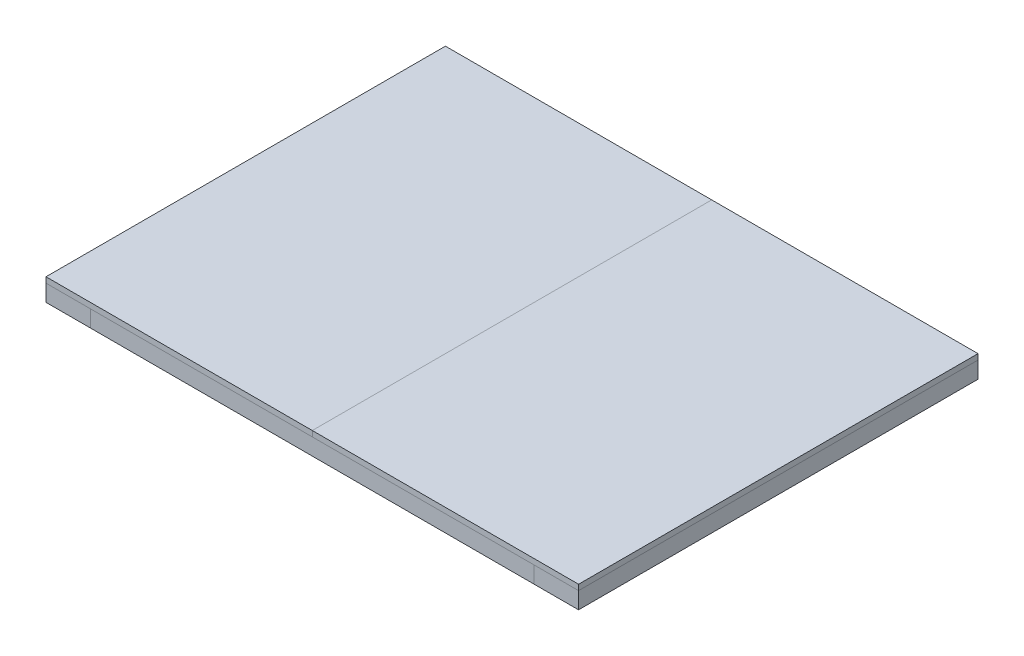
ISO-10303-21;
HEADER;
FILE_DESCRIPTION(('STEP AP214'),'2;1');
FILE_NAME('part.step','',(''),(''),'','','');
FILE_SCHEMA(('AUTOMOTIVE_DESIGN { 1 0 10303 214 1 1 1 1 }'));
ENDSEC;
DATA;
#1=APPLICATION_CONTEXT('core data for automotive mechanical design processes');
#2=APPLICATION_PROTOCOL_DEFINITION('international standard','automotive_design',2000,#1);
#3=PRODUCT_CONTEXT('',#1,'mechanical');
#4=PRODUCT('Part','Part','',(#3));
#5=PRODUCT_RELATED_PRODUCT_CATEGORY('part','',(#4));
#6=PRODUCT_DEFINITION_FORMATION('','',#4);
#7=PRODUCT_DEFINITION_CONTEXT('part definition',#1,'design');
#8=PRODUCT_DEFINITION('design','',#6,#7);
#9=PRODUCT_DEFINITION_SHAPE('','',#8);
#10=(LENGTH_UNIT() NAMED_UNIT(*) SI_UNIT(.MILLI.,.METRE.));
#11=(NAMED_UNIT(*) PLANE_ANGLE_UNIT() SI_UNIT($,.RADIAN.));
#12=(NAMED_UNIT(*) SI_UNIT($,.STERADIAN.) SOLID_ANGLE_UNIT());
#13=UNCERTAINTY_MEASURE_WITH_UNIT(LENGTH_MEASURE(1.E-05),#10,'distance_accuracy_value','');
#14=(GEOMETRIC_REPRESENTATION_CONTEXT(3) GLOBAL_UNCERTAINTY_ASSIGNED_CONTEXT((#13)) GLOBAL_UNIT_ASSIGNED_CONTEXT((#10,
#11,#12)) REPRESENTATION_CONTEXT('',''));
#15=CARTESIAN_POINT('',(0.,0.,0.));
#16=DIRECTION('',(0.,0.,1.));
#17=DIRECTION('',(1.,0.,0.));
#18=AXIS2_PLACEMENT_3D('',#15,#16,#17);
#19=CARTESIAN_POINT('',(660.4,-38.1,-812.8));
#20=DIRECTION('',(-1.,0.,0.));
#21=DIRECTION('',(0.,0.,1.));
#22=AXIS2_PLACEMENT_3D('',#19,#20,#21);
#23=PLANE('',#22);
#24=DIRECTION('',(0.,0.,1.));
#25=VECTOR('',#24,1.);
#26=CARTESIAN_POINT('',(660.4,0.,-812.8));
#27=LINE('',#26,#25);
#28=CARTESIAN_POINT('',(660.4,0.,-812.8));
#29=VERTEX_POINT('',#28);
#30=CARTESIAN_POINT('',(660.4,0.,-101.6));
#31=VERTEX_POINT('',#30);
#32=EDGE_CURVE('E115',#29,#31,#27,.T.);
#33=ORIENTED_EDGE('',*,*,#32,.T.);
#34=DIRECTION('',(0.,1.,0.));
#35=VECTOR('',#34,1.);
#36=CARTESIAN_POINT('',(660.4,-38.1,-101.6));
#37=LINE('',#36,#35);
#38=CARTESIAN_POINT('',(660.4,-38.1,-101.6));
#39=VERTEX_POINT('',#38);
#40=EDGE_CURVE('E12',#39,#31,#37,.T.);
#41=ORIENTED_EDGE('',*,*,#40,.F.);
#42=DIRECTION('',(0.,0.,1.));
#43=VECTOR('',#42,1.);
#44=CARTESIAN_POINT('',(660.4,-38.1,-812.8));
#45=LINE('',#44,#43);
#46=CARTESIAN_POINT('',(660.4,-38.1,-812.8));
#47=VERTEX_POINT('',#46);
#48=EDGE_CURVE('E103',#47,#39,#45,.T.);
#49=ORIENTED_EDGE('',*,*,#48,.F.);
#50=DIRECTION('',(0.,1.,0.));
#51=VECTOR('',#50,1.);
#52=CARTESIAN_POINT('',(660.4,-38.1,-812.8));
#53=LINE('',#52,#51);
#54=EDGE_CURVE('E111',#47,#29,#53,.T.);
#55=ORIENTED_EDGE('',*,*,#54,.T.);
#56=EDGE_LOOP('',(#33,#41,#49,#55));
#57=FACE_BOUND('',#56,.T.);
#58=ADVANCED_FACE('F52',(#57),#23,.F.);
#59=CARTESIAN_POINT('',(660.4,-38.1,-101.6));
#60=DIRECTION('',(0.,0.,-1.));
#61=DIRECTION('',(-1.,0.,0.));
#62=AXIS2_PLACEMENT_3D('',#59,#60,#61);
#63=PLANE('',#62);
#64=DIRECTION('',(-1.,0.,0.));
#65=VECTOR('',#64,1.);
#66=CARTESIAN_POINT('',(660.4,0.,-101.6));
#67=LINE('',#66,#65);
#68=CARTESIAN_POINT('',(558.8,0.,-101.6));
#69=VERTEX_POINT('',#68);
#70=EDGE_CURVE('E107',#31,#69,#67,.T.);
#71=ORIENTED_EDGE('',*,*,#70,.T.);
#72=DIRECTION('',(0.,1.,0.));
#73=VECTOR('',#72,1.);
#74=CARTESIAN_POINT('',(558.8,-38.1,-101.6));
#75=LINE('',#74,#73);
#76=CARTESIAN_POINT('',(558.8,-38.1,-101.6));
#77=VERTEX_POINT('',#76);
#78=EDGE_CURVE('E60',#77,#69,#75,.T.);
#79=ORIENTED_EDGE('',*,*,#78,.F.);
#80=DIRECTION('',(-1.,0.,0.));
#81=VECTOR('',#80,1.);
#82=CARTESIAN_POINT('',(660.4,-38.1,-101.6));
#83=LINE('',#82,#81);
#84=EDGE_CURVE('E98',#39,#77,#83,.T.);
#85=ORIENTED_EDGE('',*,*,#84,.F.);
#86=ORIENTED_EDGE('',*,*,#40,.T.);
#87=EDGE_LOOP('',(#71,#79,#85,#86));
#88=FACE_BOUND('',#87,.T.);
#89=ADVANCED_FACE('F106',(#88),#63,.F.);
#90=CARTESIAN_POINT('',(558.8,-38.1,-812.8));
#91=DIRECTION('',(1.,0.,0.));
#92=DIRECTION('',(0.,0.,-1.));
#93=AXIS2_PLACEMENT_3D('',#90,#91,#92);
#94=PLANE('',#93);
#95=DIRECTION('',(0.,0.,-1.));
#96=VECTOR('',#95,1.);
#97=CARTESIAN_POINT('',(558.8,0.,-812.8));
#98=LINE('',#97,#96);
#99=CARTESIAN_POINT('',(558.8,0.,-812.8));
#100=VERTEX_POINT('',#99);
#101=EDGE_CURVE('E85',#69,#100,#98,.T.);
#102=ORIENTED_EDGE('',*,*,#101,.T.);
#103=DIRECTION('',(0.,1.,0.));
#104=VECTOR('',#103,1.);
#105=CARTESIAN_POINT('',(558.8,-38.1,-812.8));
#106=LINE('',#105,#104);
#107=CARTESIAN_POINT('',(558.8,-38.1,-812.8));
#108=VERTEX_POINT('',#107);
#109=EDGE_CURVE('E108',#108,#100,#106,.T.);
#110=ORIENTED_EDGE('',*,*,#109,.F.);
#111=DIRECTION('',(0.,0.,-1.));
#112=VECTOR('',#111,1.);
#113=CARTESIAN_POINT('',(558.8,-38.1,-812.8));
#114=LINE('',#113,#112);
#115=EDGE_CURVE('E101',#77,#108,#114,.T.);
#116=ORIENTED_EDGE('',*,*,#115,.F.);
#117=ORIENTED_EDGE('',*,*,#78,.T.);
#118=EDGE_LOOP('',(#102,#110,#116,#117));
#119=FACE_BOUND('',#118,.T.);
#120=ADVANCED_FACE('F109',(#119),#94,.F.);
#121=CARTESIAN_POINT('',(660.4,-38.1,-812.8));
#122=DIRECTION('',(0.,0.,1.));
#123=DIRECTION('',(1.,0.,0.));
#124=AXIS2_PLACEMENT_3D('',#121,#122,#123);
#125=PLANE('',#124);
#126=DIRECTION('',(1.,0.,0.));
#127=VECTOR('',#126,1.);
#128=CARTESIAN_POINT('',(660.4,0.,-812.8));
#129=LINE('',#128,#127);
#130=EDGE_CURVE('E91',#100,#29,#129,.T.);
#131=ORIENTED_EDGE('',*,*,#130,.T.);
#132=ORIENTED_EDGE('',*,*,#54,.F.);
#133=DIRECTION('',(1.,0.,0.));
#134=VECTOR('',#133,1.);
#135=CARTESIAN_POINT('',(660.4,-38.1,-812.8));
#136=LINE('',#135,#134);
#137=EDGE_CURVE('E68',#108,#47,#136,.T.);
#138=ORIENTED_EDGE('',*,*,#137,.F.);
#139=ORIENTED_EDGE('',*,*,#109,.T.);
#140=EDGE_LOOP('',(#131,#132,#138,#139));
#141=FACE_BOUND('',#140,.T.);
#142=ADVANCED_FACE('F122',(#141),#125,.F.);
#143=CARTESIAN_POINT('',(0.,-38.1,0.));
#144=DIRECTION('',(0.,-1.,0.));
#145=DIRECTION('',(0.,0.,-1.));
#146=AXIS2_PLACEMENT_3D('',#143,#144,#145);
#147=PLANE('',#146);
#148=ORIENTED_EDGE('',*,*,#48,.T.);
#149=ORIENTED_EDGE('',*,*,#84,.T.);
#150=ORIENTED_EDGE('',*,*,#115,.T.);
#151=ORIENTED_EDGE('',*,*,#137,.T.);
#152=EDGE_LOOP('',(#148,#149,#150,#151));
#153=FACE_BOUND('',#152,.T.);
#154=ADVANCED_FACE('F99',(#153),#147,.T.);
#155=CARTESIAN_POINT('',(0.,0.,0.));
#156=DIRECTION('',(0.,-1.,0.));
#157=DIRECTION('',(0.,0.,-1.));
#158=AXIS2_PLACEMENT_3D('',#155,#156,#157);
#159=PLANE('',#158);
#160=ORIENTED_EDGE('',*,*,#32,.F.);
#161=ORIENTED_EDGE('',*,*,#130,.F.);
#162=ORIENTED_EDGE('',*,*,#101,.F.);
#163=ORIENTED_EDGE('',*,*,#70,.F.);
#164=EDGE_LOOP('',(#160,#161,#162,#163));
#165=FACE_BOUND('',#164,.T.);
#166=ADVANCED_FACE('F125',(#165),#159,.F.);
#167=CLOSED_SHELL('',(#58,#89,#120,#142,#154,#166));
#168=MANIFOLD_SOLID_BREP('B2',#167);
#169=CARTESIAN_POINT('',(1117.6,-38.1,-914.4));
#170=DIRECTION('',(-1.,0.,0.));
#171=DIRECTION('',(0.,0.,1.));
#172=AXIS2_PLACEMENT_3D('',#169,#170,#171);
#173=PLANE('',#172);
#174=DIRECTION('',(0.,0.,1.));
#175=VECTOR('',#174,1.);
#176=CARTESIAN_POINT('',(1117.6,0.,-914.4));
#177=LINE('',#176,#175);
#178=CARTESIAN_POINT('',(1117.6,0.,-914.4));
#179=VERTEX_POINT('',#178);
#180=CARTESIAN_POINT('',(1117.6,0.,-812.8));
#181=VERTEX_POINT('',#180);
#182=EDGE_CURVE('E249',#179,#181,#177,.T.);
#183=ORIENTED_EDGE('',*,*,#182,.T.);
#184=DIRECTION('',(0.,1.,0.));
#185=VECTOR('',#184,1.);
#186=CARTESIAN_POINT('',(1117.6,-38.1,-812.8));
#187=LINE('',#186,#185);
#188=CARTESIAN_POINT('',(1117.6,-38.1,-812.8));
#189=VERTEX_POINT('',#188);
#190=EDGE_CURVE('E50',#189,#181,#187,.T.);
#191=ORIENTED_EDGE('',*,*,#190,.F.);
#192=DIRECTION('',(0.,0.,1.));
#193=VECTOR('',#192,1.);
#194=CARTESIAN_POINT('',(1117.6,-38.1,-914.4));
#195=LINE('',#194,#193);
#196=CARTESIAN_POINT('',(1117.6,-38.1,-914.4));
#197=VERTEX_POINT('',#196);
#198=EDGE_CURVE('E237',#197,#189,#195,.T.);
#199=ORIENTED_EDGE('',*,*,#198,.F.);
#200=DIRECTION('',(0.,1.,0.));
#201=VECTOR('',#200,1.);
#202=CARTESIAN_POINT('',(1117.6,-38.1,-914.4));
#203=LINE('',#202,#201);
#204=EDGE_CURVE('E245',#197,#179,#203,.T.);
#205=ORIENTED_EDGE('',*,*,#204,.T.);
#206=EDGE_LOOP('',(#183,#191,#199,#205));
#207=FACE_BOUND('',#206,.T.);
#208=ADVANCED_FACE('F186',(#207),#173,.F.);
#209=CARTESIAN_POINT('',(1117.6,-38.1,-812.8));
#210=DIRECTION('',(0.,0.,-1.));
#211=DIRECTION('',(-1.,0.,0.));
#212=AXIS2_PLACEMENT_3D('',#209,#210,#211);
#213=PLANE('',#212);
#214=DIRECTION('',(-1.,0.,0.));
#215=VECTOR('',#214,1.);
#216=CARTESIAN_POINT('',(1117.6,0.,-812.8));
#217=LINE('',#216,#215);
#218=CARTESIAN_POINT('',(101.6,0.,-812.8));
#219=VERTEX_POINT('',#218);
#220=EDGE_CURVE('E241',#181,#219,#217,.T.);
#221=ORIENTED_EDGE('',*,*,#220,.T.);
#222=DIRECTION('',(0.,1.,0.));
#223=VECTOR('',#222,1.);
#224=CARTESIAN_POINT('',(101.6,-38.1,-812.8));
#225=LINE('',#224,#223);
#226=CARTESIAN_POINT('',(101.6,-38.1,-812.8));
#227=VERTEX_POINT('',#226);
#228=EDGE_CURVE('E194',#227,#219,#225,.T.);
#229=ORIENTED_EDGE('',*,*,#228,.F.);
#230=DIRECTION('',(-1.,0.,0.));
#231=VECTOR('',#230,1.);
#232=CARTESIAN_POINT('',(1117.6,-38.1,-812.8));
#233=LINE('',#232,#231);
#234=EDGE_CURVE('E232',#189,#227,#233,.T.);
#235=ORIENTED_EDGE('',*,*,#234,.F.);
#236=ORIENTED_EDGE('',*,*,#190,.T.);
#237=EDGE_LOOP('',(#221,#229,#235,#236));
#238=FACE_BOUND('',#237,.T.);
#239=ADVANCED_FACE('F240',(#238),#213,.F.);
#240=CARTESIAN_POINT('',(101.6,-38.1,-914.4));
#241=DIRECTION('',(1.,0.,0.));
#242=DIRECTION('',(0.,0.,-1.));
#243=AXIS2_PLACEMENT_3D('',#240,#241,#242);
#244=PLANE('',#243);
#245=DIRECTION('',(0.,0.,-1.));
#246=VECTOR('',#245,1.);
#247=CARTESIAN_POINT('',(101.6,0.,-914.4));
#248=LINE('',#247,#246);
#249=CARTESIAN_POINT('',(101.6,0.,-914.4));
#250=VERTEX_POINT('',#249);
#251=EDGE_CURVE('E219',#219,#250,#248,.T.);
#252=ORIENTED_EDGE('',*,*,#251,.T.);
#253=DIRECTION('',(0.,1.,0.));
#254=VECTOR('',#253,1.);
#255=CARTESIAN_POINT('',(101.6,-38.1,-914.4));
#256=LINE('',#255,#254);
#257=CARTESIAN_POINT('',(101.6,-38.1,-914.4));
#258=VERTEX_POINT('',#257);
#259=EDGE_CURVE('E242',#258,#250,#256,.T.);
#260=ORIENTED_EDGE('',*,*,#259,.F.);
#261=DIRECTION('',(0.,0.,-1.));
#262=VECTOR('',#261,1.);
#263=CARTESIAN_POINT('',(101.6,-38.1,-914.4));
#264=LINE('',#263,#262);
#265=EDGE_CURVE('E235',#227,#258,#264,.T.);
#266=ORIENTED_EDGE('',*,*,#265,.F.);
#267=ORIENTED_EDGE('',*,*,#228,.T.);
#268=EDGE_LOOP('',(#252,#260,#266,#267));
#269=FACE_BOUND('',#268,.T.);
#270=ADVANCED_FACE('F243',(#269),#244,.F.);
#271=CARTESIAN_POINT('',(1117.6,-38.1,-914.4));
#272=DIRECTION('',(0.,0.,1.));
#273=DIRECTION('',(1.,0.,0.));
#274=AXIS2_PLACEMENT_3D('',#271,#272,#273);
#275=PLANE('',#274);
#276=DIRECTION('',(1.,0.,0.));
#277=VECTOR('',#276,1.);
#278=CARTESIAN_POINT('',(1117.6,0.,-914.4));
#279=LINE('',#278,#277);
#280=EDGE_CURVE('E225',#250,#179,#279,.T.);
#281=ORIENTED_EDGE('',*,*,#280,.T.);
#282=ORIENTED_EDGE('',*,*,#204,.F.);
#283=DIRECTION('',(1.,0.,0.));
#284=VECTOR('',#283,1.);
#285=CARTESIAN_POINT('',(1117.6,-38.1,-914.4));
#286=LINE('',#285,#284);
#287=EDGE_CURVE('E202',#258,#197,#286,.T.);
#288=ORIENTED_EDGE('',*,*,#287,.F.);
#289=ORIENTED_EDGE('',*,*,#259,.T.);
#290=EDGE_LOOP('',(#281,#282,#288,#289));
#291=FACE_BOUND('',#290,.T.);
#292=ADVANCED_FACE('F256',(#291),#275,.F.);
#293=CARTESIAN_POINT('',(0.,-38.1,0.));
#294=DIRECTION('',(0.,-1.,0.));
#295=DIRECTION('',(0.,0.,-1.));
#296=AXIS2_PLACEMENT_3D('',#293,#294,#295);
#297=PLANE('',#296);
#298=ORIENTED_EDGE('',*,*,#198,.T.);
#299=ORIENTED_EDGE('',*,*,#234,.T.);
#300=ORIENTED_EDGE('',*,*,#265,.T.);
#301=ORIENTED_EDGE('',*,*,#287,.T.);
#302=EDGE_LOOP('',(#298,#299,#300,#301));
#303=FACE_BOUND('',#302,.T.);
#304=ADVANCED_FACE('F233',(#303),#297,.T.);
#305=CARTESIAN_POINT('',(0.,0.,0.));
#306=DIRECTION('',(0.,-1.,0.));
#307=DIRECTION('',(0.,0.,-1.));
#308=AXIS2_PLACEMENT_3D('',#305,#306,#307);
#309=PLANE('',#308);
#310=ORIENTED_EDGE('',*,*,#182,.F.);
#311=ORIENTED_EDGE('',*,*,#280,.F.);
#312=ORIENTED_EDGE('',*,*,#251,.F.);
#313=ORIENTED_EDGE('',*,*,#220,.F.);
#314=EDGE_LOOP('',(#310,#311,#312,#313));
#315=FACE_BOUND('',#314,.T.);
#316=ADVANCED_FACE('F259',(#315),#309,.F.);
#317=CLOSED_SHELL('',(#208,#239,#270,#292,#304,#316));
#318=MANIFOLD_SOLID_BREP('B6',#317);
#319=CARTESIAN_POINT('',(1117.6,-38.1,0.));
#320=DIRECTION('',(-1.,0.,0.));
#321=DIRECTION('',(0.,0.,1.));
#322=AXIS2_PLACEMENT_3D('',#319,#320,#321);
#323=PLANE('',#322);
#324=DIRECTION('',(0.,0.,1.));
#325=VECTOR('',#324,1.);
#326=CARTESIAN_POINT('',(1117.6,0.,0.));
#327=LINE('',#326,#325);
#328=CARTESIAN_POINT('',(1117.6,0.,-101.6));
#329=VERTEX_POINT('',#328);
#330=CARTESIAN_POINT('',(1117.6,0.,0.));
#331=VERTEX_POINT('',#330);
#332=EDGE_CURVE('E383',#329,#331,#327,.T.);
#333=ORIENTED_EDGE('',*,*,#332,.T.);
#334=DIRECTION('',(0.,1.,0.));
#335=VECTOR('',#334,1.);
#336=CARTESIAN_POINT('',(1117.6,-38.1,0.));
#337=LINE('',#336,#335);
#338=CARTESIAN_POINT('',(1117.6,-38.1,0.));
#339=VERTEX_POINT('',#338);
#340=EDGE_CURVE('E184',#339,#331,#337,.T.);
#341=ORIENTED_EDGE('',*,*,#340,.F.);
#342=DIRECTION('',(0.,0.,1.));
#343=VECTOR('',#342,1.);
#344=CARTESIAN_POINT('',(1117.6,-38.1,0.));
#345=LINE('',#344,#343);
#346=CARTESIAN_POINT('',(1117.6,-38.1,-101.6));
#347=VERTEX_POINT('',#346);
#348=EDGE_CURVE('E371',#347,#339,#345,.T.);
#349=ORIENTED_EDGE('',*,*,#348,.F.);
#350=DIRECTION('',(0.,1.,0.));
#351=VECTOR('',#350,1.);
#352=CARTESIAN_POINT('',(1117.6,-38.1,-101.6));
#353=LINE('',#352,#351);
#354=EDGE_CURVE('E379',#347,#329,#353,.T.);
#355=ORIENTED_EDGE('',*,*,#354,.T.);
#356=EDGE_LOOP('',(#333,#341,#349,#355));
#357=FACE_BOUND('',#356,.T.);
#358=ADVANCED_FACE('F320',(#357),#323,.F.);
#359=CARTESIAN_POINT('',(1117.6,-38.1,0.));
#360=DIRECTION('',(0.,0.,-1.));
#361=DIRECTION('',(-1.,0.,0.));
#362=AXIS2_PLACEMENT_3D('',#359,#360,#361);
#363=PLANE('',#362);
#364=DIRECTION('',(-1.,0.,0.));
#365=VECTOR('',#364,1.);
#366=CARTESIAN_POINT('',(1117.6,0.,0.));
#367=LINE('',#366,#365);
#368=CARTESIAN_POINT('',(101.6,0.,0.));
#369=VERTEX_POINT('',#368);
#370=EDGE_CURVE('E375',#331,#369,#367,.T.);
#371=ORIENTED_EDGE('',*,*,#370,.T.);
#372=DIRECTION('',(0.,1.,0.));
#373=VECTOR('',#372,1.);
#374=CARTESIAN_POINT('',(101.6,-38.1,0.));
#375=LINE('',#374,#373);
#376=CARTESIAN_POINT('',(101.6,-38.1,0.));
#377=VERTEX_POINT('',#376);
#378=EDGE_CURVE('E328',#377,#369,#375,.T.);
#379=ORIENTED_EDGE('',*,*,#378,.F.);
#380=DIRECTION('',(-1.,0.,0.));
#381=VECTOR('',#380,1.);
#382=CARTESIAN_POINT('',(1117.6,-38.1,0.));
#383=LINE('',#382,#381);
#384=EDGE_CURVE('E366',#339,#377,#383,.T.);
#385=ORIENTED_EDGE('',*,*,#384,.F.);
#386=ORIENTED_EDGE('',*,*,#340,.T.);
#387=EDGE_LOOP('',(#371,#379,#385,#386));
#388=FACE_BOUND('',#387,.T.);
#389=ADVANCED_FACE('F374',(#388),#363,.F.);
#390=CARTESIAN_POINT('',(101.6,-38.1,0.));
#391=DIRECTION('',(1.,0.,0.));
#392=DIRECTION('',(0.,0.,-1.));
#393=AXIS2_PLACEMENT_3D('',#390,#391,#392);
#394=PLANE('',#393);
#395=DIRECTION('',(0.,0.,-1.));
#396=VECTOR('',#395,1.);
#397=CARTESIAN_POINT('',(101.6,0.,0.));
#398=LINE('',#397,#396);
#399=CARTESIAN_POINT('',(101.6,0.,-101.6));
#400=VERTEX_POINT('',#399);
#401=EDGE_CURVE('E353',#369,#400,#398,.T.);
#402=ORIENTED_EDGE('',*,*,#401,.T.);
#403=DIRECTION('',(0.,1.,0.));
#404=VECTOR('',#403,1.);
#405=CARTESIAN_POINT('',(101.6,-38.1,-101.6));
#406=LINE('',#405,#404);
#407=CARTESIAN_POINT('',(101.6,-38.1,-101.6));
#408=VERTEX_POINT('',#407);
#409=EDGE_CURVE('E376',#408,#400,#406,.T.);
#410=ORIENTED_EDGE('',*,*,#409,.F.);
#411=DIRECTION('',(0.,0.,-1.));
#412=VECTOR('',#411,1.);
#413=CARTESIAN_POINT('',(101.6,-38.1,0.));
#414=LINE('',#413,#412);
#415=EDGE_CURVE('E369',#377,#408,#414,.T.);
#416=ORIENTED_EDGE('',*,*,#415,.F.);
#417=ORIENTED_EDGE('',*,*,#378,.T.);
#418=EDGE_LOOP('',(#402,#410,#416,#417));
#419=FACE_BOUND('',#418,.T.);
#420=ADVANCED_FACE('F377',(#419),#394,.F.);
#421=CARTESIAN_POINT('',(1117.6,-38.1,-101.6));
#422=DIRECTION('',(0.,0.,1.));
#423=DIRECTION('',(1.,0.,0.));
#424=AXIS2_PLACEMENT_3D('',#421,#422,#423);
#425=PLANE('',#424);
#426=DIRECTION('',(1.,0.,0.));
#427=VECTOR('',#426,1.);
#428=CARTESIAN_POINT('',(1117.6,0.,-101.6));
#429=LINE('',#428,#427);
#430=EDGE_CURVE('E359',#400,#329,#429,.T.);
#431=ORIENTED_EDGE('',*,*,#430,.T.);
#432=ORIENTED_EDGE('',*,*,#354,.F.);
#433=DIRECTION('',(1.,0.,0.));
#434=VECTOR('',#433,1.);
#435=CARTESIAN_POINT('',(1117.6,-38.1,-101.6));
#436=LINE('',#435,#434);
#437=EDGE_CURVE('E336',#408,#347,#436,.T.);
#438=ORIENTED_EDGE('',*,*,#437,.F.);
#439=ORIENTED_EDGE('',*,*,#409,.T.);
#440=EDGE_LOOP('',(#431,#432,#438,#439));
#441=FACE_BOUND('',#440,.T.);
#442=ADVANCED_FACE('F390',(#441),#425,.F.);
#443=CARTESIAN_POINT('',(0.,-38.1,0.));
#444=DIRECTION('',(0.,1.,0.));
#445=DIRECTION('',(0.,0.,1.));
#446=AXIS2_PLACEMENT_3D('',#443,#444,#445);
#447=PLANE('',#446);
#448=ORIENTED_EDGE('',*,*,#348,.T.);
#449=ORIENTED_EDGE('',*,*,#384,.T.);
#450=ORIENTED_EDGE('',*,*,#415,.T.);
#451=ORIENTED_EDGE('',*,*,#437,.T.);
#452=EDGE_LOOP('',(#448,#449,#450,#451));
#453=FACE_BOUND('',#452,.T.);
#454=ADVANCED_FACE('F367',(#453),#447,.F.);
#455=CARTESIAN_POINT('',(0.,0.,0.));
#456=DIRECTION('',(0.,1.,0.));
#457=DIRECTION('',(0.,0.,1.));
#458=AXIS2_PLACEMENT_3D('',#455,#456,#457);
#459=PLANE('',#458);
#460=ORIENTED_EDGE('',*,*,#332,.F.);
#461=ORIENTED_EDGE('',*,*,#430,.F.);
#462=ORIENTED_EDGE('',*,*,#401,.F.);
#463=ORIENTED_EDGE('',*,*,#370,.F.);
#464=EDGE_LOOP('',(#460,#461,#462,#463));
#465=FACE_BOUND('',#464,.T.);
#466=ADVANCED_FACE('F393',(#465),#459,.T.);
#467=CLOSED_SHELL('',(#358,#389,#420,#442,#454,#466));
#468=MANIFOLD_SOLID_BREP('B44',#467);
#469=CARTESIAN_POINT('',(0.,-38.1,-914.4));
#470=DIRECTION('',(1.,0.,0.));
#471=DIRECTION('',(0.,0.,-1.));
#472=AXIS2_PLACEMENT_3D('',#469,#470,#471);
#473=PLANE('',#472);
#474=DIRECTION('',(0.,0.,-1.));
#475=VECTOR('',#474,1.);
#476=CARTESIAN_POINT('',(0.,0.,-914.4));
#477=LINE('',#476,#475);
#478=CARTESIAN_POINT('',(0.,0.,0.));
#479=VERTEX_POINT('',#478);
#480=CARTESIAN_POINT('',(0.,0.,-914.4));
#481=VERTEX_POINT('',#480);
#482=EDGE_CURVE('E517',#479,#481,#477,.T.);
#483=ORIENTED_EDGE('',*,*,#482,.T.);
#484=DIRECTION('',(0.,1.,0.));
#485=VECTOR('',#484,1.);
#486=CARTESIAN_POINT('',(0.,-38.1,-914.4));
#487=LINE('',#486,#485);
#488=CARTESIAN_POINT('',(0.,-38.1,-914.4));
#489=VERTEX_POINT('',#488);
#490=EDGE_CURVE('E318',#489,#481,#487,.T.);
#491=ORIENTED_EDGE('',*,*,#490,.F.);
#492=DIRECTION('',(0.,0.,-1.));
#493=VECTOR('',#492,1.);
#494=CARTESIAN_POINT('',(0.,-38.1,-914.4));
#495=LINE('',#494,#493);
#496=CARTESIAN_POINT('',(0.,-38.1,0.));
#497=VERTEX_POINT('',#496);
#498=EDGE_CURVE('E505',#497,#489,#495,.T.);
#499=ORIENTED_EDGE('',*,*,#498,.F.);
#500=DIRECTION('',(0.,1.,0.));
#501=VECTOR('',#500,1.);
#502=CARTESIAN_POINT('',(0.,-38.1,0.));
#503=LINE('',#502,#501);
#504=EDGE_CURVE('E513',#497,#479,#503,.T.);
#505=ORIENTED_EDGE('',*,*,#504,.T.);
#506=EDGE_LOOP('',(#483,#491,#499,#505));
#507=FACE_BOUND('',#506,.T.);
#508=ADVANCED_FACE('F454',(#507),#473,.F.);
#509=CARTESIAN_POINT('',(0.,-38.1,-914.4));
#510=DIRECTION('',(0.,0.,1.));
#511=DIRECTION('',(1.,0.,0.));
#512=AXIS2_PLACEMENT_3D('',#509,#510,#511);
#513=PLANE('',#512);
#514=DIRECTION('',(1.,0.,0.));
#515=VECTOR('',#514,1.);
#516=CARTESIAN_POINT('',(0.,0.,-914.4));
#517=LINE('',#516,#515);
#518=CARTESIAN_POINT('',(101.6,0.,-914.4));
#519=VERTEX_POINT('',#518);
#520=EDGE_CURVE('E509',#481,#519,#517,.T.);
#521=ORIENTED_EDGE('',*,*,#520,.T.);
#522=DIRECTION('',(0.,1.,0.));
#523=VECTOR('',#522,1.);
#524=CARTESIAN_POINT('',(101.6,-38.1,-914.4));
#525=LINE('',#524,#523);
#526=CARTESIAN_POINT('',(101.6,-38.1,-914.4));
#527=VERTEX_POINT('',#526);
#528=EDGE_CURVE('E462',#527,#519,#525,.T.);
#529=ORIENTED_EDGE('',*,*,#528,.F.);
#530=DIRECTION('',(1.,0.,0.));
#531=VECTOR('',#530,1.);
#532=CARTESIAN_POINT('',(0.,-38.1,-914.4));
#533=LINE('',#532,#531);
#534=EDGE_CURVE('E500',#489,#527,#533,.T.);
#535=ORIENTED_EDGE('',*,*,#534,.F.);
#536=ORIENTED_EDGE('',*,*,#490,.T.);
#537=EDGE_LOOP('',(#521,#529,#535,#536));
#538=FACE_BOUND('',#537,.T.);
#539=ADVANCED_FACE('F508',(#538),#513,.F.);
#540=CARTESIAN_POINT('',(101.6,-38.1,-914.4));
#541=DIRECTION('',(-1.,0.,0.));
#542=DIRECTION('',(0.,0.,1.));
#543=AXIS2_PLACEMENT_3D('',#540,#541,#542);
#544=PLANE('',#543);
#545=DIRECTION('',(0.,0.,1.));
#546=VECTOR('',#545,1.);
#547=CARTESIAN_POINT('',(101.6,0.,-914.4));
#548=LINE('',#547,#546);
#549=CARTESIAN_POINT('',(101.6,0.,0.));
#550=VERTEX_POINT('',#549);
#551=EDGE_CURVE('E487',#519,#550,#548,.T.);
#552=ORIENTED_EDGE('',*,*,#551,.T.);
#553=DIRECTION('',(0.,1.,0.));
#554=VECTOR('',#553,1.);
#555=CARTESIAN_POINT('',(101.6,-38.1,0.));
#556=LINE('',#555,#554);
#557=CARTESIAN_POINT('',(101.6,-38.1,0.));
#558=VERTEX_POINT('',#557);
#559=EDGE_CURVE('E510',#558,#550,#556,.T.);
#560=ORIENTED_EDGE('',*,*,#559,.F.);
#561=DIRECTION('',(0.,0.,1.));
#562=VECTOR('',#561,1.);
#563=CARTESIAN_POINT('',(101.6,-38.1,-914.4));
#564=LINE('',#563,#562);
#565=EDGE_CURVE('E503',#527,#558,#564,.T.);
#566=ORIENTED_EDGE('',*,*,#565,.F.);
#567=ORIENTED_EDGE('',*,*,#528,.T.);
#568=EDGE_LOOP('',(#552,#560,#566,#567));
#569=FACE_BOUND('',#568,.T.);
#570=ADVANCED_FACE('F511',(#569),#544,.F.);
#571=CARTESIAN_POINT('',(0.,-38.1,0.));
#572=DIRECTION('',(0.,0.,-1.));
#573=DIRECTION('',(-1.,0.,0.));
#574=AXIS2_PLACEMENT_3D('',#571,#572,#573);
#575=PLANE('',#574);
#576=DIRECTION('',(-1.,0.,0.));
#577=VECTOR('',#576,1.);
#578=CARTESIAN_POINT('',(0.,0.,0.));
#579=LINE('',#578,#577);
#580=EDGE_CURVE('E493',#550,#479,#579,.T.);
#581=ORIENTED_EDGE('',*,*,#580,.T.);
#582=ORIENTED_EDGE('',*,*,#504,.F.);
#583=DIRECTION('',(-1.,0.,0.));
#584=VECTOR('',#583,1.);
#585=CARTESIAN_POINT('',(0.,-38.1,0.));
#586=LINE('',#585,#584);
#587=EDGE_CURVE('E470',#558,#497,#586,.T.);
#588=ORIENTED_EDGE('',*,*,#587,.F.);
#589=ORIENTED_EDGE('',*,*,#559,.T.);
#590=EDGE_LOOP('',(#581,#582,#588,#589));
#591=FACE_BOUND('',#590,.T.);
#592=ADVANCED_FACE('F524',(#591),#575,.F.);
#593=CARTESIAN_POINT('',(0.,-38.1,0.));
#594=DIRECTION('',(0.,1.,0.));
#595=DIRECTION('',(0.,0.,1.));
#596=AXIS2_PLACEMENT_3D('',#593,#594,#595);
#597=PLANE('',#596);
#598=ORIENTED_EDGE('',*,*,#498,.T.);
#599=ORIENTED_EDGE('',*,*,#534,.T.);
#600=ORIENTED_EDGE('',*,*,#565,.T.);
#601=ORIENTED_EDGE('',*,*,#587,.T.);
#602=EDGE_LOOP('',(#598,#599,#600,#601));
#603=FACE_BOUND('',#602,.T.);
#604=ADVANCED_FACE('F501',(#603),#597,.F.);
#605=CARTESIAN_POINT('',(0.,0.,0.));
#606=DIRECTION('',(0.,1.,0.));
#607=DIRECTION('',(0.,0.,1.));
#608=AXIS2_PLACEMENT_3D('',#605,#606,#607);
#609=PLANE('',#608);
#610=ORIENTED_EDGE('',*,*,#482,.F.);
#611=ORIENTED_EDGE('',*,*,#580,.F.);
#612=ORIENTED_EDGE('',*,*,#551,.F.);
#613=ORIENTED_EDGE('',*,*,#520,.F.);
#614=EDGE_LOOP('',(#610,#611,#612,#613));
#615=FACE_BOUND('',#614,.T.);
#616=ADVANCED_FACE('F527',(#615),#609,.T.);
#617=CLOSED_SHELL('',(#508,#539,#570,#592,#604,#616));
#618=MANIFOLD_SOLID_BREP('B178',#617);
#619=CARTESIAN_POINT('',(1219.2,-38.1,-914.4));
#620=DIRECTION('',(-1.,0.,0.));
#621=DIRECTION('',(0.,0.,1.));
#622=AXIS2_PLACEMENT_3D('',#619,#620,#621);
#623=PLANE('',#622);
#624=DIRECTION('',(0.,0.,1.));
#625=VECTOR('',#624,1.);
#626=CARTESIAN_POINT('',(1219.2,0.,-914.4));
#627=LINE('',#626,#625);
#628=CARTESIAN_POINT('',(1219.2,0.,-914.4));
#629=VERTEX_POINT('',#628);
#630=CARTESIAN_POINT('',(1219.2,0.,0.));
#631=VERTEX_POINT('',#630);
#632=EDGE_CURVE('E651',#629,#631,#627,.T.);
#633=ORIENTED_EDGE('',*,*,#632,.T.);
#634=DIRECTION('',(0.,1.,0.));
#635=VECTOR('',#634,1.);
#636=CARTESIAN_POINT('',(1219.2,-38.1,0.));
#637=LINE('',#636,#635);
#638=CARTESIAN_POINT('',(1219.2,-38.1,0.));
#639=VERTEX_POINT('',#638);
#640=EDGE_CURVE('E452',#639,#631,#637,.T.);
#641=ORIENTED_EDGE('',*,*,#640,.F.);
#642=DIRECTION('',(0.,0.,1.));
#643=VECTOR('',#642,1.);
#644=CARTESIAN_POINT('',(1219.2,-38.1,-914.4));
#645=LINE('',#644,#643);
#646=CARTESIAN_POINT('',(1219.2,-38.1,-914.4));
#647=VERTEX_POINT('',#646);
#648=EDGE_CURVE('E639',#647,#639,#645,.T.);
#649=ORIENTED_EDGE('',*,*,#648,.F.);
#650=DIRECTION('',(0.,1.,0.));
#651=VECTOR('',#650,1.);
#652=CARTESIAN_POINT('',(1219.2,-38.1,-914.4));
#653=LINE('',#652,#651);
#654=EDGE_CURVE('E647',#647,#629,#653,.T.);
#655=ORIENTED_EDGE('',*,*,#654,.T.);
#656=EDGE_LOOP('',(#633,#641,#649,#655));
#657=FACE_BOUND('',#656,.T.);
#658=ADVANCED_FACE('F588',(#657),#623,.F.);
#659=CARTESIAN_POINT('',(1219.2,-38.1,0.));
#660=DIRECTION('',(0.,0.,-1.));
#661=DIRECTION('',(-1.,0.,0.));
#662=AXIS2_PLACEMENT_3D('',#659,#660,#661);
#663=PLANE('',#662);
#664=DIRECTION('',(-1.,0.,0.));
#665=VECTOR('',#664,1.);
#666=CARTESIAN_POINT('',(1219.2,0.,0.));
#667=LINE('',#666,#665);
#668=CARTESIAN_POINT('',(1117.6,0.,0.));
#669=VERTEX_POINT('',#668);
#670=EDGE_CURVE('E643',#631,#669,#667,.T.);
#671=ORIENTED_EDGE('',*,*,#670,.T.);
#672=DIRECTION('',(0.,1.,0.));
#673=VECTOR('',#672,1.);
#674=CARTESIAN_POINT('',(1117.6,-38.1,0.));
#675=LINE('',#674,#673);
#676=CARTESIAN_POINT('',(1117.6,-38.1,0.));
#677=VERTEX_POINT('',#676);
#678=EDGE_CURVE('E596',#677,#669,#675,.T.);
#679=ORIENTED_EDGE('',*,*,#678,.F.);
#680=DIRECTION('',(-1.,0.,0.));
#681=VECTOR('',#680,1.);
#682=CARTESIAN_POINT('',(1219.2,-38.1,0.));
#683=LINE('',#682,#681);
#684=EDGE_CURVE('E634',#639,#677,#683,.T.);
#685=ORIENTED_EDGE('',*,*,#684,.F.);
#686=ORIENTED_EDGE('',*,*,#640,.T.);
#687=EDGE_LOOP('',(#671,#679,#685,#686));
#688=FACE_BOUND('',#687,.T.);
#689=ADVANCED_FACE('F642',(#688),#663,.F.);
#690=CARTESIAN_POINT('',(1117.6,-38.1,-914.4));
#691=DIRECTION('',(1.,0.,0.));
#692=DIRECTION('',(0.,0.,-1.));
#693=AXIS2_PLACEMENT_3D('',#690,#691,#692);
#694=PLANE('',#693);
#695=DIRECTION('',(0.,0.,-1.));
#696=VECTOR('',#695,1.);
#697=CARTESIAN_POINT('',(1117.6,0.,-914.4));
#698=LINE('',#697,#696);
#699=CARTESIAN_POINT('',(1117.6,0.,-914.4));
#700=VERTEX_POINT('',#699);
#701=EDGE_CURVE('E621',#669,#700,#698,.T.);
#702=ORIENTED_EDGE('',*,*,#701,.T.);
#703=DIRECTION('',(0.,1.,0.));
#704=VECTOR('',#703,1.);
#705=CARTESIAN_POINT('',(1117.6,-38.1,-914.4));
#706=LINE('',#705,#704);
#707=CARTESIAN_POINT('',(1117.6,-38.1,-914.4));
#708=VERTEX_POINT('',#707);
#709=EDGE_CURVE('E644',#708,#700,#706,.T.);
#710=ORIENTED_EDGE('',*,*,#709,.F.);
#711=DIRECTION('',(0.,0.,-1.));
#712=VECTOR('',#711,1.);
#713=CARTESIAN_POINT('',(1117.6,-38.1,-914.4));
#714=LINE('',#713,#712);
#715=EDGE_CURVE('E637',#677,#708,#714,.T.);
#716=ORIENTED_EDGE('',*,*,#715,.F.);
#717=ORIENTED_EDGE('',*,*,#678,.T.);
#718=EDGE_LOOP('',(#702,#710,#716,#717));
#719=FACE_BOUND('',#718,.T.);
#720=ADVANCED_FACE('F645',(#719),#694,.F.);
#721=CARTESIAN_POINT('',(1219.2,-38.1,-914.4));
#722=DIRECTION('',(0.,0.,1.));
#723=DIRECTION('',(1.,0.,0.));
#724=AXIS2_PLACEMENT_3D('',#721,#722,#723);
#725=PLANE('',#724);
#726=DIRECTION('',(1.,0.,0.));
#727=VECTOR('',#726,1.);
#728=CARTESIAN_POINT('',(1219.2,0.,-914.4));
#729=LINE('',#728,#727);
#730=EDGE_CURVE('E627',#700,#629,#729,.T.);
#731=ORIENTED_EDGE('',*,*,#730,.T.);
#732=ORIENTED_EDGE('',*,*,#654,.F.);
#733=DIRECTION('',(1.,0.,0.));
#734=VECTOR('',#733,1.);
#735=CARTESIAN_POINT('',(1219.2,-38.1,-914.4));
#736=LINE('',#735,#734);
#737=EDGE_CURVE('E604',#708,#647,#736,.T.);
#738=ORIENTED_EDGE('',*,*,#737,.F.);
#739=ORIENTED_EDGE('',*,*,#709,.T.);
#740=EDGE_LOOP('',(#731,#732,#738,#739));
#741=FACE_BOUND('',#740,.T.);
#742=ADVANCED_FACE('F658',(#741),#725,.F.);
#743=CARTESIAN_POINT('',(0.,-38.1,0.));
#744=DIRECTION('',(0.,-1.,0.));
#745=DIRECTION('',(0.,0.,-1.));
#746=AXIS2_PLACEMENT_3D('',#743,#744,#745);
#747=PLANE('',#746);
#748=ORIENTED_EDGE('',*,*,#648,.T.);
#749=ORIENTED_EDGE('',*,*,#684,.T.);
#750=ORIENTED_EDGE('',*,*,#715,.T.);
#751=ORIENTED_EDGE('',*,*,#737,.T.);
#752=EDGE_LOOP('',(#748,#749,#750,#751));
#753=FACE_BOUND('',#752,.T.);
#754=ADVANCED_FACE('F635',(#753),#747,.T.);
#755=CARTESIAN_POINT('',(0.,0.,0.));
#756=DIRECTION('',(0.,-1.,0.));
#757=DIRECTION('',(0.,0.,-1.));
#758=AXIS2_PLACEMENT_3D('',#755,#756,#757);
#759=PLANE('',#758);
#760=ORIENTED_EDGE('',*,*,#632,.F.);
#761=ORIENTED_EDGE('',*,*,#730,.F.);
#762=ORIENTED_EDGE('',*,*,#701,.F.);
#763=ORIENTED_EDGE('',*,*,#670,.F.);
#764=EDGE_LOOP('',(#760,#761,#762,#763));
#765=FACE_BOUND('',#764,.T.);
#766=ADVANCED_FACE('F661',(#765),#759,.F.);
#767=CLOSED_SHELL('',(#658,#689,#720,#742,#754,#766));
#768=MANIFOLD_SOLID_BREP('B312',#767);
#769=CARTESIAN_POINT('',(609.6,12.7,0.));
#770=DIRECTION('',(1.,0.,0.));
#771=DIRECTION('',(0.,0.,-1.));
#772=AXIS2_PLACEMENT_3D('',#769,#770,#771);
#773=PLANE('',#772);
#774=DIRECTION('',(0.,0.,1.));
#775=VECTOR('',#774,1.);
#776=CARTESIAN_POINT('',(609.6,0.,0.));
#777=LINE('',#776,#775);
#778=CARTESIAN_POINT('',(609.6,0.,-914.4));
#779=VERTEX_POINT('',#778);
#780=CARTESIAN_POINT('',(609.6,0.,0.));
#781=VERTEX_POINT('',#780);
#782=EDGE_CURVE('E784',#779,#781,#777,.T.);
#783=ORIENTED_EDGE('',*,*,#782,.T.);
#784=DIRECTION('',(0.,-1.,0.));
#785=VECTOR('',#784,1.);
#786=CARTESIAN_POINT('',(609.6,12.7,0.));
#787=LINE('',#786,#785);
#788=CARTESIAN_POINT('',(609.6,12.7,0.));
#789=VERTEX_POINT('',#788);
#790=EDGE_CURVE('E586',#789,#781,#787,.T.);
#791=ORIENTED_EDGE('',*,*,#790,.F.);
#792=DIRECTION('',(0.,0.,1.));
#793=VECTOR('',#792,1.);
#794=CARTESIAN_POINT('',(609.6,12.7,0.));
#795=LINE('',#794,#793);
#796=CARTESIAN_POINT('',(609.6,12.7,-914.4));
#797=VERTEX_POINT('',#796);
#798=EDGE_CURVE('E772',#797,#789,#795,.T.);
#799=ORIENTED_EDGE('',*,*,#798,.F.);
#800=DIRECTION('',(0.,-1.,0.));
#801=VECTOR('',#800,1.);
#802=CARTESIAN_POINT('',(609.6,12.7,-914.4));
#803=LINE('',#802,#801);
#804=EDGE_CURVE('E780',#797,#779,#803,.T.);
#805=ORIENTED_EDGE('',*,*,#804,.T.);
#806=EDGE_LOOP('',(#783,#791,#799,#805));
#807=FACE_BOUND('',#806,.T.);
#808=ADVANCED_FACE('F721',(#807),#773,.F.);
#809=CARTESIAN_POINT('',(609.6,12.7,0.));
#810=DIRECTION('',(0.,0.,-1.));
#811=DIRECTION('',(-1.,0.,0.));
#812=AXIS2_PLACEMENT_3D('',#809,#810,#811);
#813=PLANE('',#812);
#814=DIRECTION('',(1.,0.,0.));
#815=VECTOR('',#814,1.);
#816=CARTESIAN_POINT('',(609.6,0.,0.));
#817=LINE('',#816,#815);
#818=CARTESIAN_POINT('',(1219.2,0.,0.));
#819=VERTEX_POINT('',#818);
#820=EDGE_CURVE('E776',#781,#819,#817,.T.);
#821=ORIENTED_EDGE('',*,*,#820,.T.);
#822=DIRECTION('',(0.,-1.,0.));
#823=VECTOR('',#822,1.);
#824=CARTESIAN_POINT('',(1219.2,12.7,0.));
#825=LINE('',#824,#823);
#826=CARTESIAN_POINT('',(1219.2,12.7,0.));
#827=VERTEX_POINT('',#826);
#828=EDGE_CURVE('E729',#827,#819,#825,.T.);
#829=ORIENTED_EDGE('',*,*,#828,.F.);
#830=DIRECTION('',(1.,0.,0.));
#831=VECTOR('',#830,1.);
#832=CARTESIAN_POINT('',(609.6,12.7,0.));
#833=LINE('',#832,#831);
#834=EDGE_CURVE('E767',#789,#827,#833,.T.);
#835=ORIENTED_EDGE('',*,*,#834,.F.);
#836=ORIENTED_EDGE('',*,*,#790,.T.);
#837=EDGE_LOOP('',(#821,#829,#835,#836));
#838=FACE_BOUND('',#837,.T.);
#839=ADVANCED_FACE('F775',(#838),#813,.F.);
#840=CARTESIAN_POINT('',(1219.2,12.7,0.));
#841=DIRECTION('',(-1.,0.,0.));
#842=DIRECTION('',(0.,0.,1.));
#843=AXIS2_PLACEMENT_3D('',#840,#841,#842);
#844=PLANE('',#843);
#845=DIRECTION('',(0.,0.,-1.));
#846=VECTOR('',#845,1.);
#847=CARTESIAN_POINT('',(1219.2,0.,0.));
#848=LINE('',#847,#846);
#849=CARTESIAN_POINT('',(1219.2,0.,-914.4));
#850=VERTEX_POINT('',#849);
#851=EDGE_CURVE('E754',#819,#850,#848,.T.);
#852=ORIENTED_EDGE('',*,*,#851,.T.);
#853=DIRECTION('',(0.,-1.,0.));
#854=VECTOR('',#853,1.);
#855=CARTESIAN_POINT('',(1219.2,12.7,-914.4));
#856=LINE('',#855,#854);
#857=CARTESIAN_POINT('',(1219.2,12.7,-914.4));
#858=VERTEX_POINT('',#857);
#859=EDGE_CURVE('E777',#858,#850,#856,.T.);
#860=ORIENTED_EDGE('',*,*,#859,.F.);
#861=DIRECTION('',(0.,0.,-1.));
#862=VECTOR('',#861,1.);
#863=CARTESIAN_POINT('',(1219.2,12.7,0.));
#864=LINE('',#863,#862);
#865=EDGE_CURVE('E770',#827,#858,#864,.T.);
#866=ORIENTED_EDGE('',*,*,#865,.F.);
#867=ORIENTED_EDGE('',*,*,#828,.T.);
#868=EDGE_LOOP('',(#852,#860,#866,#867));
#869=FACE_BOUND('',#868,.T.);
#870=ADVANCED_FACE('F778',(#869),#844,.F.);
#871=CARTESIAN_POINT('',(609.6,12.7,-914.4));
#872=DIRECTION('',(0.,0.,1.));
#873=DIRECTION('',(1.,0.,0.));
#874=AXIS2_PLACEMENT_3D('',#871,#872,#873);
#875=PLANE('',#874);
#876=DIRECTION('',(-1.,0.,0.));
#877=VECTOR('',#876,1.);
#878=CARTESIAN_POINT('',(609.6,0.,-914.4));
#879=LINE('',#878,#877);
#880=EDGE_CURVE('E760',#850,#779,#879,.T.);
#881=ORIENTED_EDGE('',*,*,#880,.T.);
#882=ORIENTED_EDGE('',*,*,#804,.F.);
#883=DIRECTION('',(-1.,0.,0.));
#884=VECTOR('',#883,1.);
#885=CARTESIAN_POINT('',(609.6,12.7,-914.4));
#886=LINE('',#885,#884);
#887=EDGE_CURVE('E737',#858,#797,#886,.T.);
#888=ORIENTED_EDGE('',*,*,#887,.F.);
#889=ORIENTED_EDGE('',*,*,#859,.T.);
#890=EDGE_LOOP('',(#881,#882,#888,#889));
#891=FACE_BOUND('',#890,.T.);
#892=ADVANCED_FACE('F791',(#891),#875,.F.);
#893=CARTESIAN_POINT('',(0.,12.7,0.));
#894=DIRECTION('',(0.,-1.,0.));
#895=DIRECTION('',(0.,0.,-1.));
#896=AXIS2_PLACEMENT_3D('',#893,#894,#895);
#897=PLANE('',#896);
#898=ORIENTED_EDGE('',*,*,#798,.T.);
#899=ORIENTED_EDGE('',*,*,#834,.T.);
#900=ORIENTED_EDGE('',*,*,#865,.T.);
#901=ORIENTED_EDGE('',*,*,#887,.T.);
#902=EDGE_LOOP('',(#898,#899,#900,#901));
#903=FACE_BOUND('',#902,.T.);
#904=ADVANCED_FACE('F768',(#903),#897,.F.);
#905=CARTESIAN_POINT('',(0.,0.,0.));
#906=DIRECTION('',(0.,-1.,0.));
#907=DIRECTION('',(0.,0.,-1.));
#908=AXIS2_PLACEMENT_3D('',#905,#906,#907);
#909=PLANE('',#908);
#910=ORIENTED_EDGE('',*,*,#782,.F.);
#911=ORIENTED_EDGE('',*,*,#880,.F.);
#912=ORIENTED_EDGE('',*,*,#851,.F.);
#913=ORIENTED_EDGE('',*,*,#820,.F.);
#914=EDGE_LOOP('',(#910,#911,#912,#913));
#915=FACE_BOUND('',#914,.T.);
#916=ADVANCED_FACE('F794',(#915),#909,.T.);
#917=CLOSED_SHELL('',(#808,#839,#870,#892,#904,#916));
#918=MANIFOLD_SOLID_BREP('B446',#917);
#919=CARTESIAN_POINT('',(0.,12.7,0.));
#920=DIRECTION('',(1.,0.,0.));
#921=DIRECTION('',(0.,0.,-1.));
#922=AXIS2_PLACEMENT_3D('',#919,#920,#921);
#923=PLANE('',#922);
#924=DIRECTION('',(0.,0.,1.));
#925=VECTOR('',#924,1.);
#926=CARTESIAN_POINT('',(0.,0.,0.));
#927=LINE('',#926,#925);
#928=CARTESIAN_POINT('',(0.,0.,-914.4));
#929=VERTEX_POINT('',#928);
#930=CARTESIAN_POINT('',(0.,0.,0.));
#931=VERTEX_POINT('',#930);
#932=EDGE_CURVE('E908',#929,#931,#927,.T.);
#933=ORIENTED_EDGE('',*,*,#932,.T.);
#934=DIRECTION('',(0.,-1.,0.));
#935=VECTOR('',#934,1.);
#936=CARTESIAN_POINT('',(0.,12.7,0.));
#937=LINE('',#936,#935);
#938=CARTESIAN_POINT('',(0.,12.7,0.));
#939=VERTEX_POINT('',#938);
#940=EDGE_CURVE('E719',#939,#931,#937,.T.);
#941=ORIENTED_EDGE('',*,*,#940,.F.);
#942=DIRECTION('',(0.,0.,1.));
#943=VECTOR('',#942,1.);
#944=CARTESIAN_POINT('',(0.,12.7,0.));
#945=LINE('',#944,#943);
#946=CARTESIAN_POINT('',(0.,12.7,-914.4));
#947=VERTEX_POINT('',#946);
#948=EDGE_CURVE('E896',#947,#939,#945,.T.);
#949=ORIENTED_EDGE('',*,*,#948,.F.);
#950=DIRECTION('',(0.,-1.,0.));
#951=VECTOR('',#950,1.);
#952=CARTESIAN_POINT('',(0.,12.7,-914.4));
#953=LINE('',#952,#951);
#954=EDGE_CURVE('E904',#947,#929,#953,.T.);
#955=ORIENTED_EDGE('',*,*,#954,.T.);
#956=EDGE_LOOP('',(#933,#941,#949,#955));
#957=FACE_BOUND('',#956,.T.);
#958=ADVANCED_FACE('F845',(#957),#923,.F.);
#959=CARTESIAN_POINT('',(0.,12.7,0.));
#960=DIRECTION('',(0.,0.,-1.));
#961=DIRECTION('',(-1.,0.,0.));
#962=AXIS2_PLACEMENT_3D('',#959,#960,#961);
#963=PLANE('',#962);
#964=DIRECTION('',(1.,0.,0.));
#965=VECTOR('',#964,1.);
#966=CARTESIAN_POINT('',(0.,0.,0.));
#967=LINE('',#966,#965);
#968=CARTESIAN_POINT('',(609.6,0.,0.));
#969=VERTEX_POINT('',#968);
#970=EDGE_CURVE('E900',#931,#969,#967,.T.);
#971=ORIENTED_EDGE('',*,*,#970,.T.);
#972=DIRECTION('',(0.,-1.,0.));
#973=VECTOR('',#972,1.);
#974=CARTESIAN_POINT('',(609.6,12.7,0.));
#975=LINE('',#974,#973);
#976=CARTESIAN_POINT('',(609.6,12.7,0.));
#977=VERTEX_POINT('',#976);
#978=EDGE_CURVE('E853',#977,#969,#975,.T.);
#979=ORIENTED_EDGE('',*,*,#978,.F.);
#980=DIRECTION('',(1.,0.,0.));
#981=VECTOR('',#980,1.);
#982=CARTESIAN_POINT('',(0.,12.7,0.));
#983=LINE('',#982,#981);
#984=EDGE_CURVE('E891',#939,#977,#983,.T.);
#985=ORIENTED_EDGE('',*,*,#984,.F.);
#986=ORIENTED_EDGE('',*,*,#940,.T.);
#987=EDGE_LOOP('',(#971,#979,#985,#986));
#988=FACE_BOUND('',#987,.T.);
#989=ADVANCED_FACE('F899',(#988),#963,.F.);
#990=CARTESIAN_POINT('',(609.6,12.7,0.));
#991=DIRECTION('',(-1.,0.,0.));
#992=DIRECTION('',(0.,0.,1.));
#993=AXIS2_PLACEMENT_3D('',#990,#991,#992);
#994=PLANE('',#993);
#995=DIRECTION('',(0.,0.,-1.));
#996=VECTOR('',#995,1.);
#997=CARTESIAN_POINT('',(609.6,0.,0.));
#998=LINE('',#997,#996);
#999=CARTESIAN_POINT('',(609.6,0.,-914.4));
#1000=VERTEX_POINT('',#999);
#1001=EDGE_CURVE('E878',#969,#1000,#998,.T.);
#1002=ORIENTED_EDGE('',*,*,#1001,.T.);
#1003=DIRECTION('',(0.,-1.,0.));
#1004=VECTOR('',#1003,1.);
#1005=CARTESIAN_POINT('',(609.6,12.7,-914.4));
#1006=LINE('',#1005,#1004);
#1007=CARTESIAN_POINT('',(609.6,12.7,-914.4));
#1008=VERTEX_POINT('',#1007);
#1009=EDGE_CURVE('E901',#1008,#1000,#1006,.T.);
#1010=ORIENTED_EDGE('',*,*,#1009,.F.);
#1011=DIRECTION('',(0.,0.,-1.));
#1012=VECTOR('',#1011,1.);
#1013=CARTESIAN_POINT('',(609.6,12.7,0.));
#1014=LINE('',#1013,#1012);
#1015=EDGE_CURVE('E894',#977,#1008,#1014,.T.);
#1016=ORIENTED_EDGE('',*,*,#1015,.F.);
#1017=ORIENTED_EDGE('',*,*,#978,.T.);
#1018=EDGE_LOOP('',(#1002,#1010,#1016,#1017));
#1019=FACE_BOUND('',#1018,.T.);
#1020=ADVANCED_FACE('F902',(#1019),#994,.F.);
#1021=CARTESIAN_POINT('',(0.,12.7,-914.4));
#1022=DIRECTION('',(0.,0.,1.));
#1023=DIRECTION('',(1.,0.,0.));
#1024=AXIS2_PLACEMENT_3D('',#1021,#1022,#1023);
#1025=PLANE('',#1024);
#1026=DIRECTION('',(-1.,0.,0.));
#1027=VECTOR('',#1026,1.);
#1028=CARTESIAN_POINT('',(0.,0.,-914.4));
#1029=LINE('',#1028,#1027);
#1030=EDGE_CURVE('E884',#1000,#929,#1029,.T.);
#1031=ORIENTED_EDGE('',*,*,#1030,.T.);
#1032=ORIENTED_EDGE('',*,*,#954,.F.);
#1033=DIRECTION('',(-1.,0.,0.));
#1034=VECTOR('',#1033,1.);
#1035=CARTESIAN_POINT('',(0.,12.7,-914.4));
#1036=LINE('',#1035,#1034);
#1037=EDGE_CURVE('E861',#1008,#947,#1036,.T.);
#1038=ORIENTED_EDGE('',*,*,#1037,.F.);
#1039=ORIENTED_EDGE('',*,*,#1009,.T.);
#1040=EDGE_LOOP('',(#1031,#1032,#1038,#1039));
#1041=FACE_BOUND('',#1040,.T.);
#1042=ADVANCED_FACE('F915',(#1041),#1025,.F.);
#1043=CARTESIAN_POINT('',(0.,12.7,0.));
#1044=DIRECTION('',(0.,-1.,0.));
#1045=DIRECTION('',(0.,0.,-1.));
#1046=AXIS2_PLACEMENT_3D('',#1043,#1044,#1045);
#1047=PLANE('',#1046);
#1048=ORIENTED_EDGE('',*,*,#948,.T.);
#1049=ORIENTED_EDGE('',*,*,#984,.T.);
#1050=ORIENTED_EDGE('',*,*,#1015,.T.);
#1051=ORIENTED_EDGE('',*,*,#1037,.T.);
#1052=EDGE_LOOP('',(#1048,#1049,#1050,#1051));
#1053=FACE_BOUND('',#1052,.T.);
#1054=ADVANCED_FACE('F892',(#1053),#1047,.F.);
#1055=CARTESIAN_POINT('',(0.,0.,0.));
#1056=DIRECTION('',(0.,-1.,0.));
#1057=DIRECTION('',(0.,0.,-1.));
#1058=AXIS2_PLACEMENT_3D('',#1055,#1056,#1057);
#1059=PLANE('',#1058);
#1060=ORIENTED_EDGE('',*,*,#932,.F.);
#1061=ORIENTED_EDGE('',*,*,#1030,.F.);
#1062=ORIENTED_EDGE('',*,*,#1001,.F.);
#1063=ORIENTED_EDGE('',*,*,#970,.F.);
#1064=EDGE_LOOP('',(#1060,#1061,#1062,#1063));
#1065=FACE_BOUND('',#1064,.T.);
#1066=ADVANCED_FACE('F918',(#1065),#1059,.T.);
#1067=CLOSED_SHELL('',(#958,#989,#1020,#1042,#1054,#1066));
#1068=MANIFOLD_SOLID_BREP('B580',#1067);
#1069=ADVANCED_BREP_SHAPE_REPRESENTATION('',(#18,#168,#318,#468,#618,#768,#918,#1068),#14);
#1070=SHAPE_DEFINITION_REPRESENTATION(#9,#1069);
ENDSEC;
END-ISO-10303-21;
